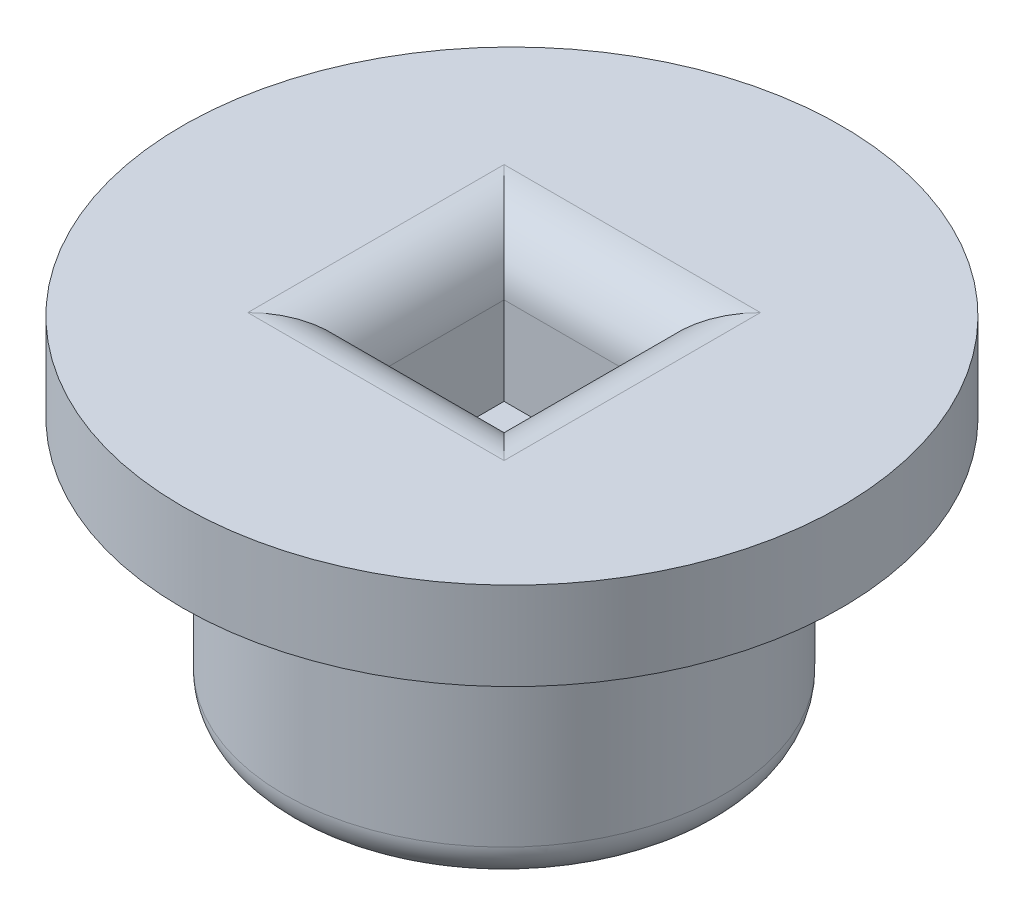
ISO-10303-21;
HEADER;
FILE_DESCRIPTION(('STEP AP214'),'2;1');
FILE_NAME('part.step','',(''),(''),'','','');
FILE_SCHEMA(('AUTOMOTIVE_DESIGN { 1 0 10303 214 1 1 1 1 }'));
ENDSEC;
DATA;
#1=APPLICATION_CONTEXT('core data for automotive mechanical design processes');
#2=APPLICATION_PROTOCOL_DEFINITION('international standard','automotive_design',2000,#1);
#3=PRODUCT_CONTEXT('',#1,'mechanical');
#4=PRODUCT('Part','Part','',(#3));
#5=PRODUCT_RELATED_PRODUCT_CATEGORY('part','',(#4));
#6=PRODUCT_DEFINITION_FORMATION('','',#4);
#7=PRODUCT_DEFINITION_CONTEXT('part definition',#1,'design');
#8=PRODUCT_DEFINITION('design','',#6,#7);
#9=PRODUCT_DEFINITION_SHAPE('','',#8);
#10=(LENGTH_UNIT() NAMED_UNIT(*) SI_UNIT(.MILLI.,.METRE.));
#11=(NAMED_UNIT(*) PLANE_ANGLE_UNIT() SI_UNIT($,.RADIAN.));
#12=(NAMED_UNIT(*) SI_UNIT($,.STERADIAN.) SOLID_ANGLE_UNIT());
#13=UNCERTAINTY_MEASURE_WITH_UNIT(LENGTH_MEASURE(1.E-05),#10,'distance_accuracy_value','');
#14=(GEOMETRIC_REPRESENTATION_CONTEXT(3) GLOBAL_UNCERTAINTY_ASSIGNED_CONTEXT((#13)) GLOBAL_UNIT_ASSIGNED_CONTEXT((#10,
#11,#12)) REPRESENTATION_CONTEXT('',''));
#15=CARTESIAN_POINT('',(0.,0.,0.));
#16=DIRECTION('',(0.,0.,1.));
#17=DIRECTION('',(1.,0.,0.));
#18=AXIS2_PLACEMENT_3D('',#15,#16,#17);
#19=CARTESIAN_POINT('',(0.,3.5,0.));
#20=DIRECTION('',(0.,-1.,0.));
#21=DIRECTION('',(0.,0.,-1.));
#22=AXIS2_PLACEMENT_3D('',#19,#20,#21);
#23=CYLINDRICAL_SURFACE('',#22,3.);
#24=CARTESIAN_POINT('',(0.,0.5,0.));
#25=DIRECTION('',(0.,1.,0.));
#26=DIRECTION('',(0.,0.,1.));
#27=AXIS2_PLACEMENT_3D('',#24,#25,#26);
#28=CIRCLE('',#27,3.);
#29=CARTESIAN_POINT('',(0.,0.5,3.));
#30=VERTEX_POINT('',#29);
#31=EDGE_CURVE('E130',#30,#30,#28,.T.);
#32=ORIENTED_EDGE('',*,*,#31,.T.);
#33=EDGE_LOOP('',(#32));
#34=FACE_BOUND('',#33,.T.);
#35=CARTESIAN_POINT('',(0.,3.5,0.));
#36=DIRECTION('',(0.,1.,0.));
#37=DIRECTION('',(0.,0.,1.));
#38=AXIS2_PLACEMENT_3D('',#35,#36,#37);
#39=CIRCLE('',#38,3.);
#40=CARTESIAN_POINT('',(0.,3.5,3.));
#41=VERTEX_POINT('',#40);
#42=EDGE_CURVE('E125',#41,#41,#39,.T.);
#43=ORIENTED_EDGE('',*,*,#42,.F.);
#44=EDGE_LOOP('',(#43));
#45=FACE_BOUND('',#44,.T.);
#46=ADVANCED_FACE('F33',(#34,#45),#23,.T.);
#47=CARTESIAN_POINT('',(0.,0.,0.));
#48=DIRECTION('',(0.,1.,0.));
#49=DIRECTION('',(0.,0.,1.));
#50=AXIS2_PLACEMENT_3D('',#47,#48,#49);
#51=PLANE('',#50);
#52=CARTESIAN_POINT('',(0.,0.,0.));
#53=DIRECTION('',(0.,1.,0.));
#54=DIRECTION('',(0.,0.,1.));
#55=AXIS2_PLACEMENT_3D('',#52,#53,#54);
#56=CIRCLE('',#55,2.5);
#57=CARTESIAN_POINT('',(0.,0.,2.5));
#58=VERTEX_POINT('',#57);
#59=EDGE_CURVE('E133',#58,#58,#56,.F.);
#60=ORIENTED_EDGE('',*,*,#59,.T.);
#61=EDGE_LOOP('',(#60));
#62=FACE_BOUND('',#61,.T.);
#63=ADVANCED_FACE('F181',(#62),#51,.F.);
#64=CARTESIAN_POINT('',(0.0948799538174616,4.7,-0.0120273730239729));
#65=DIRECTION('',(0.,-1.,0.));
#66=DIRECTION('',(0.,0.,-1.));
#67=AXIS2_PLACEMENT_3D('',#64,#65,#66);
#68=CYLINDRICAL_SURFACE('',#67,4.5);
#69=CARTESIAN_POINT('',(0.0948799538174616,4.7,-0.0120273730239729));
#70=DIRECTION('',(0.,1.,0.));
#71=DIRECTION('',(0.,0.,1.));
#72=AXIS2_PLACEMENT_3D('',#69,#70,#71);
#73=CIRCLE('',#72,4.5);
#74=CARTESIAN_POINT('',(0.0948799538174616,4.7,4.48797262697603));
#75=VERTEX_POINT('',#74);
#76=EDGE_CURVE('E122',#75,#75,#73,.T.);
#77=ORIENTED_EDGE('',*,*,#76,.F.);
#78=EDGE_LOOP('',(#77));
#79=FACE_BOUND('',#78,.T.);
#80=CARTESIAN_POINT('',(0.0948799538174616,3.5,-0.0120273730239729));
#81=DIRECTION('',(0.,1.,0.));
#82=DIRECTION('',(0.,0.,1.));
#83=AXIS2_PLACEMENT_3D('',#80,#81,#82);
#84=CIRCLE('',#83,4.5);
#85=CARTESIAN_POINT('',(0.0948799538174616,3.5,4.48797262697603));
#86=VERTEX_POINT('',#85);
#87=EDGE_CURVE('E118',#86,#86,#84,.T.);
#88=ORIENTED_EDGE('',*,*,#87,.T.);
#89=EDGE_LOOP('',(#88));
#90=FACE_BOUND('',#89,.T.);
#91=ADVANCED_FACE('F187',(#79,#90),#68,.T.);
#92=CARTESIAN_POINT('',(0.0948799538174616,4.7,-0.0120273730239729));
#93=DIRECTION('',(0.,1.,0.));
#94=DIRECTION('',(0.,0.,1.));
#95=AXIS2_PLACEMENT_3D('',#92,#93,#94);
#96=PLANE('',#95);
#97=DIRECTION('',(0.,0.,-1.));
#98=VECTOR('',#97,1.);
#99=CARTESIAN_POINT('',(1.75,4.7,0.95));
#100=LINE('',#99,#98);
#101=CARTESIAN_POINT('',(1.75,4.7,-1.75));
#102=VERTEX_POINT('',#101);
#103=CARTESIAN_POINT('',(1.75,4.7,1.75));
#104=VERTEX_POINT('',#103);
#105=EDGE_CURVE('E138',#102,#104,#100,.F.);
#106=ORIENTED_EDGE('',*,*,#105,.T.);
#107=DIRECTION('',(1.,0.,0.));
#108=VECTOR('',#107,1.);
#109=CARTESIAN_POINT('',(-0.95,4.7,1.75));
#110=LINE('',#109,#108);
#111=CARTESIAN_POINT('',(-1.75,4.7,1.75));
#112=VERTEX_POINT('',#111);
#113=EDGE_CURVE('E144',#104,#112,#110,.F.);
#114=ORIENTED_EDGE('',*,*,#113,.T.);
#115=DIRECTION('',(0.,0.,1.));
#116=VECTOR('',#115,1.);
#117=CARTESIAN_POINT('',(-1.75,4.7,-0.95));
#118=LINE('',#117,#116);
#119=CARTESIAN_POINT('',(-1.75,4.7,-1.75));
#120=VERTEX_POINT('',#119);
#121=EDGE_CURVE('E142',#112,#120,#118,.F.);
#122=ORIENTED_EDGE('',*,*,#121,.T.);
#123=DIRECTION('',(-1.,0.,0.));
#124=VECTOR('',#123,1.);
#125=CARTESIAN_POINT('',(0.95,4.7,-1.75));
#126=LINE('',#125,#124);
#127=EDGE_CURVE('E140',#120,#102,#126,.F.);
#128=ORIENTED_EDGE('',*,*,#127,.T.);
#129=EDGE_LOOP('',(#106,#114,#122,#128));
#130=FACE_BOUND('',#129,.T.);
#131=ORIENTED_EDGE('',*,*,#76,.T.);
#132=EDGE_LOOP('',(#131));
#133=FACE_BOUND('',#132,.T.);
#134=ADVANCED_FACE('F244',(#130,#133),#96,.T.);
#135=CARTESIAN_POINT('',(0.0948799538174616,3.5,-0.0120273730239729));
#136=DIRECTION('',(0.,1.,0.));
#137=DIRECTION('',(0.,0.,1.));
#138=AXIS2_PLACEMENT_3D('',#135,#136,#137);
#139=PLANE('',#138);
#140=ORIENTED_EDGE('',*,*,#42,.T.);
#141=EDGE_LOOP('',(#140));
#142=FACE_BOUND('',#141,.T.);
#143=ORIENTED_EDGE('',*,*,#87,.F.);
#144=EDGE_LOOP('',(#143));
#145=FACE_BOUND('',#144,.T.);
#146=ADVANCED_FACE('F177',(#142,#145),#139,.F.);
#147=CARTESIAN_POINT('',(-0.95,2.7,0.95));
#148=DIRECTION('',(-1.,0.,0.));
#149=DIRECTION('',(0.,0.,1.));
#150=AXIS2_PLACEMENT_3D('',#147,#148,#149);
#151=PLANE('',#150);
#152=DIRECTION('',(0.,1.,0.));
#153=VECTOR('',#152,1.);
#154=CARTESIAN_POINT('',(-0.95,2.7,-0.95));
#155=LINE('',#154,#153);
#156=CARTESIAN_POINT('',(-0.95,2.7,-0.95));
#157=VERTEX_POINT('',#156);
#158=CARTESIAN_POINT('',(-0.95,3.9,-0.95));
#159=VERTEX_POINT('',#158);
#160=EDGE_CURVE('E116',#157,#159,#155,.T.);
#161=ORIENTED_EDGE('',*,*,#160,.T.);
#162=DIRECTION('',(0.,0.,1.));
#163=VECTOR('',#162,1.);
#164=CARTESIAN_POINT('',(-0.95,3.9,0.95));
#165=LINE('',#164,#163);
#166=CARTESIAN_POINT('',(-0.95,3.9,0.95));
#167=VERTEX_POINT('',#166);
#168=EDGE_CURVE('E93',#159,#167,#165,.T.);
#169=ORIENTED_EDGE('',*,*,#168,.T.);
#170=DIRECTION('',(0.,1.,0.));
#171=VECTOR('',#170,1.);
#172=CARTESIAN_POINT('',(-0.95,2.7,0.95));
#173=LINE('',#172,#171);
#174=CARTESIAN_POINT('',(-0.95,2.7,0.95));
#175=VERTEX_POINT('',#174);
#176=EDGE_CURVE('E86',#175,#167,#173,.T.);
#177=ORIENTED_EDGE('',*,*,#176,.F.);
#178=DIRECTION('',(0.,0.,1.));
#179=VECTOR('',#178,1.);
#180=CARTESIAN_POINT('',(-0.95,2.7,0.95));
#181=LINE('',#180,#179);
#182=EDGE_CURVE('E90',#157,#175,#181,.T.);
#183=ORIENTED_EDGE('',*,*,#182,.F.);
#184=EDGE_LOOP('',(#161,#169,#177,#183));
#185=FACE_BOUND('',#184,.T.);
#186=ADVANCED_FACE('F88',(#185),#151,.F.);
#187=CARTESIAN_POINT('',(0.95,2.7,-0.95));
#188=DIRECTION('',(0.,0.,-1.));
#189=DIRECTION('',(-1.,0.,0.));
#190=AXIS2_PLACEMENT_3D('',#187,#188,#189);
#191=PLANE('',#190);
#192=DIRECTION('',(0.,1.,0.));
#193=VECTOR('',#192,1.);
#194=CARTESIAN_POINT('',(0.95,2.7,-0.95));
#195=LINE('',#194,#193);
#196=CARTESIAN_POINT('',(0.95,2.7,-0.95));
#197=VERTEX_POINT('',#196);
#198=CARTESIAN_POINT('',(0.95,3.9,-0.95));
#199=VERTEX_POINT('',#198);
#200=EDGE_CURVE('E119',#197,#199,#195,.T.);
#201=ORIENTED_EDGE('',*,*,#200,.T.);
#202=DIRECTION('',(-1.,0.,0.));
#203=VECTOR('',#202,1.);
#204=CARTESIAN_POINT('',(-0.95,3.9,-0.95));
#205=LINE('',#204,#203);
#206=EDGE_CURVE('E42',#199,#159,#205,.T.);
#207=ORIENTED_EDGE('',*,*,#206,.T.);
#208=ORIENTED_EDGE('',*,*,#160,.F.);
#209=DIRECTION('',(-1.,0.,0.));
#210=VECTOR('',#209,1.);
#211=CARTESIAN_POINT('',(0.95,2.7,-0.95));
#212=LINE('',#211,#210);
#213=EDGE_CURVE('E98',#197,#157,#212,.T.);
#214=ORIENTED_EDGE('',*,*,#213,.F.);
#215=EDGE_LOOP('',(#201,#207,#208,#214));
#216=FACE_BOUND('',#215,.T.);
#217=ADVANCED_FACE('F169',(#216),#191,.F.);
#218=CARTESIAN_POINT('',(0.95,2.7,0.95));
#219=DIRECTION('',(1.,0.,0.));
#220=DIRECTION('',(0.,0.,-1.));
#221=AXIS2_PLACEMENT_3D('',#218,#219,#220);
#222=PLANE('',#221);
#223=DIRECTION('',(0.,1.,0.));
#224=VECTOR('',#223,1.);
#225=CARTESIAN_POINT('',(0.95,2.7,0.95));
#226=LINE('',#225,#224);
#227=CARTESIAN_POINT('',(0.95,2.7,0.95));
#228=VERTEX_POINT('',#227);
#229=CARTESIAN_POINT('',(0.95,3.9,0.95));
#230=VERTEX_POINT('',#229);
#231=EDGE_CURVE('E97',#228,#230,#226,.T.);
#232=ORIENTED_EDGE('',*,*,#231,.T.);
#233=DIRECTION('',(0.,0.,-1.));
#234=VECTOR('',#233,1.);
#235=CARTESIAN_POINT('',(0.95,3.9,-0.95));
#236=LINE('',#235,#234);
#237=EDGE_CURVE('E11',#230,#199,#236,.T.);
#238=ORIENTED_EDGE('',*,*,#237,.T.);
#239=ORIENTED_EDGE('',*,*,#200,.F.);
#240=DIRECTION('',(0.,0.,-1.));
#241=VECTOR('',#240,1.);
#242=CARTESIAN_POINT('',(0.95,2.7,0.95));
#243=LINE('',#242,#241);
#244=EDGE_CURVE('E106',#228,#197,#243,.T.);
#245=ORIENTED_EDGE('',*,*,#244,.F.);
#246=EDGE_LOOP('',(#232,#238,#239,#245));
#247=FACE_BOUND('',#246,.T.);
#248=ADVANCED_FACE('F168',(#247),#222,.F.);
#249=CARTESIAN_POINT('',(0.95,2.7,0.95));
#250=DIRECTION('',(0.,0.,1.));
#251=DIRECTION('',(1.,0.,0.));
#252=AXIS2_PLACEMENT_3D('',#249,#250,#251);
#253=PLANE('',#252);
#254=ORIENTED_EDGE('',*,*,#176,.T.);
#255=DIRECTION('',(1.,0.,0.));
#256=VECTOR('',#255,1.);
#257=CARTESIAN_POINT('',(0.95,3.9,0.95));
#258=LINE('',#257,#256);
#259=EDGE_CURVE('E136',#167,#230,#258,.T.);
#260=ORIENTED_EDGE('',*,*,#259,.T.);
#261=ORIENTED_EDGE('',*,*,#231,.F.);
#262=DIRECTION('',(1.,0.,0.));
#263=VECTOR('',#262,1.);
#264=CARTESIAN_POINT('',(0.95,2.7,0.95));
#265=LINE('',#264,#263);
#266=EDGE_CURVE('E101',#175,#228,#265,.T.);
#267=ORIENTED_EDGE('',*,*,#266,.F.);
#268=EDGE_LOOP('',(#254,#260,#261,#267));
#269=FACE_BOUND('',#268,.T.);
#270=ADVANCED_FACE('F102',(#269),#253,.F.);
#271=CARTESIAN_POINT('',(0.,2.7,0.));
#272=DIRECTION('',(0.,1.,0.));
#273=DIRECTION('',(0.,0.,1.));
#274=AXIS2_PLACEMENT_3D('',#271,#272,#273);
#275=PLANE('',#274);
#276=ORIENTED_EDGE('',*,*,#182,.T.);
#277=ORIENTED_EDGE('',*,*,#266,.T.);
#278=ORIENTED_EDGE('',*,*,#244,.T.);
#279=ORIENTED_EDGE('',*,*,#213,.T.);
#280=EDGE_LOOP('',(#276,#277,#278,#279));
#281=FACE_BOUND('',#280,.T.);
#282=ADVANCED_FACE('F108',(#281),#275,.T.);
#283=CARTESIAN_POINT('',(0.,0.5,0.));
#284=DIRECTION('',(0.,1.,0.));
#285=DIRECTION('',(0.,0.,1.));
#286=AXIS2_PLACEMENT_3D('',#283,#284,#285);
#287=TOROIDAL_SURFACE('',#286,2.5,0.5);
#288=ORIENTED_EDGE('',*,*,#59,.F.);
#289=EDGE_LOOP('',(#288));
#290=FACE_BOUND('',#289,.T.);
#291=ORIENTED_EDGE('',*,*,#31,.F.);
#292=EDGE_LOOP('',(#291));
#293=FACE_BOUND('',#292,.T.);
#294=ADVANCED_FACE('F193',(#290,#293),#287,.T.);
#295=CARTESIAN_POINT('',(0.95,3.9,-1.75));
#296=DIRECTION('',(1.,0.,0.));
#297=DIRECTION('',(0.,0.,-1.));
#298=AXIS2_PLACEMENT_3D('',#295,#296,#297);
#299=CYLINDRICAL_SURFACE('',#298,0.8);
#300=CARTESIAN_POINT('',(1.75,3.9,-1.75));
#301=DIRECTION('',(0.707106781186548,0.,0.707106781186547));
#302=DIRECTION('',(0.707106781186547,0.,-0.707106781186548));
#303=AXIS2_PLACEMENT_3D('',#300,#301,#302);
#304=ELLIPSE('',#303,1.13137084989848,0.8);
#305=EDGE_CURVE('E112',#102,#199,#304,.T.);
#306=ORIENTED_EDGE('',*,*,#305,.F.);
#307=ORIENTED_EDGE('',*,*,#127,.F.);
#308=CARTESIAN_POINT('',(-1.75,3.9,-1.75));
#309=DIRECTION('',(0.707106781186547,0.,-0.707106781186548));
#310=DIRECTION('',(-0.707106781186548,0.,-0.707106781186547));
#311=AXIS2_PLACEMENT_3D('',#308,#309,#310);
#312=ELLIPSE('',#311,1.13137084989848,0.8);
#313=EDGE_CURVE('E37',#159,#120,#312,.F.);
#314=ORIENTED_EDGE('',*,*,#313,.F.);
#315=ORIENTED_EDGE('',*,*,#206,.F.);
#316=EDGE_LOOP('',(#306,#307,#314,#315));
#317=FACE_BOUND('',#316,.T.);
#318=ADVANCED_FACE('F35',(#317),#299,.T.);
#319=CARTESIAN_POINT('',(-1.75,3.9,0.95));
#320=DIRECTION('',(0.,0.,-1.));
#321=DIRECTION('',(-1.,0.,0.));
#322=AXIS2_PLACEMENT_3D('',#319,#320,#321);
#323=CYLINDRICAL_SURFACE('',#322,0.8);
#324=ORIENTED_EDGE('',*,*,#313,.T.);
#325=ORIENTED_EDGE('',*,*,#121,.F.);
#326=CARTESIAN_POINT('',(-1.75,3.9,1.75));
#327=DIRECTION('',(-0.707106781186548,0.,-0.707106781186547));
#328=DIRECTION('',(-0.707106781186547,0.,0.707106781186548));
#329=AXIS2_PLACEMENT_3D('',#326,#327,#328);
#330=ELLIPSE('',#329,1.13137084989848,0.8);
#331=EDGE_CURVE('E151',#167,#112,#330,.F.);
#332=ORIENTED_EDGE('',*,*,#331,.F.);
#333=ORIENTED_EDGE('',*,*,#168,.F.);
#334=EDGE_LOOP('',(#324,#325,#332,#333));
#335=FACE_BOUND('',#334,.T.);
#336=ADVANCED_FACE('F163',(#335),#323,.T.);
#337=CARTESIAN_POINT('',(1.75,3.9,0.95));
#338=DIRECTION('',(0.,0.,1.));
#339=DIRECTION('',(1.,0.,0.));
#340=AXIS2_PLACEMENT_3D('',#337,#338,#339);
#341=CYLINDRICAL_SURFACE('',#340,0.8);
#342=ORIENTED_EDGE('',*,*,#305,.T.);
#343=ORIENTED_EDGE('',*,*,#237,.F.);
#344=CARTESIAN_POINT('',(1.75,3.9,1.75));
#345=DIRECTION('',(-0.707106781186547,0.,0.707106781186548));
#346=DIRECTION('',(-0.707106781186548,0.,-0.707106781186547));
#347=AXIS2_PLACEMENT_3D('',#344,#345,#346);
#348=ELLIPSE('',#347,1.13137084989848,0.8);
#349=EDGE_CURVE('E149',#104,#230,#348,.T.);
#350=ORIENTED_EDGE('',*,*,#349,.F.);
#351=ORIENTED_EDGE('',*,*,#105,.F.);
#352=EDGE_LOOP('',(#342,#343,#350,#351));
#353=FACE_BOUND('',#352,.T.);
#354=ADVANCED_FACE('F156',(#353),#341,.T.);
#355=CARTESIAN_POINT('',(0.95,3.9,1.75));
#356=DIRECTION('',(-1.,0.,0.));
#357=DIRECTION('',(0.,0.,1.));
#358=AXIS2_PLACEMENT_3D('',#355,#356,#357);
#359=CYLINDRICAL_SURFACE('',#358,0.8);
#360=ORIENTED_EDGE('',*,*,#331,.T.);
#361=ORIENTED_EDGE('',*,*,#113,.F.);
#362=ORIENTED_EDGE('',*,*,#349,.T.);
#363=ORIENTED_EDGE('',*,*,#259,.F.);
#364=EDGE_LOOP('',(#360,#361,#362,#363));
#365=FACE_BOUND('',#364,.T.);
#366=ADVANCED_FACE('F167',(#365),#359,.T.);
#367=CLOSED_SHELL('',(#46,#63,#91,#134,#146,#186,#217,#248,#270,#282,#294,#318,#336,#354,#366));
#368=MANIFOLD_SOLID_BREP('B2',#367);
#369=ADVANCED_BREP_SHAPE_REPRESENTATION('',(#18,#368),#14);
#370=SHAPE_DEFINITION_REPRESENTATION(#9,#369);
ENDSEC;
END-ISO-10303-21;
